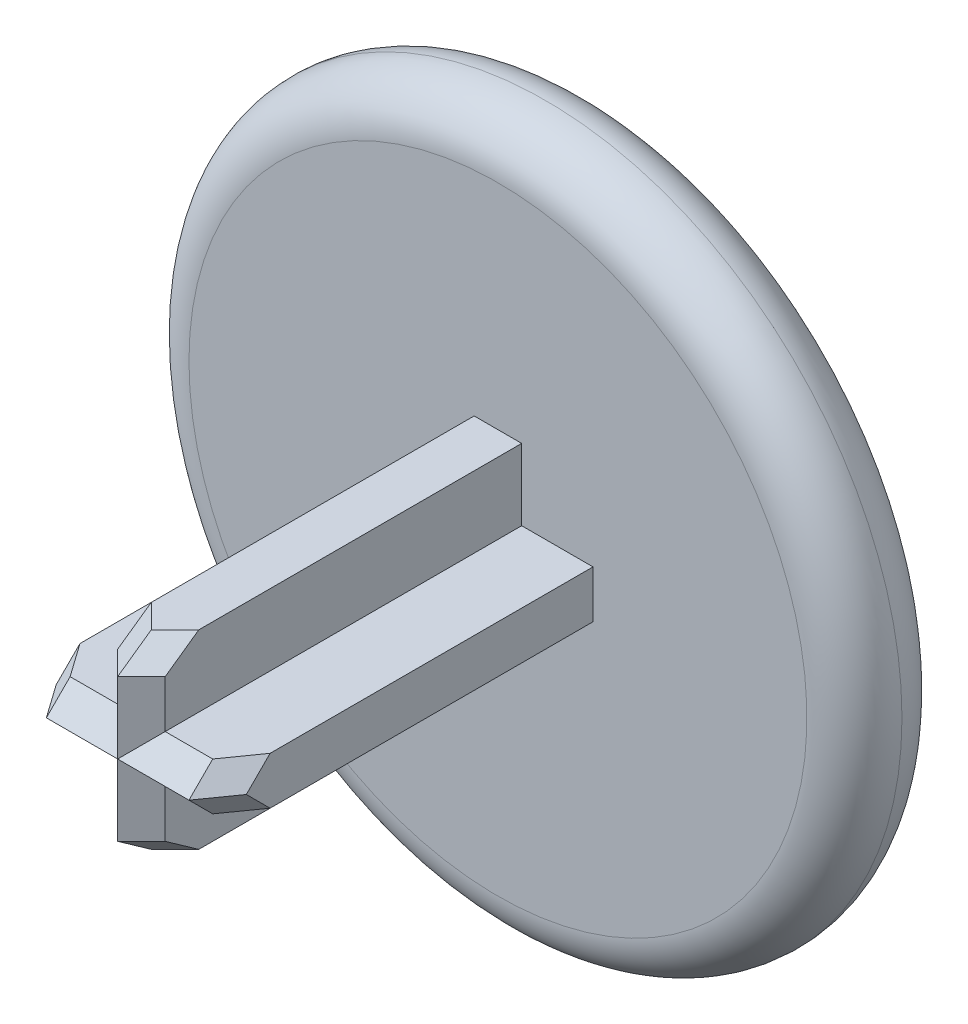
ISO-10303-21;
HEADER;
FILE_DESCRIPTION(('STEP AP214'),'2;1');
FILE_NAME('part.step','',(''),(''),'','','');
FILE_SCHEMA(('AUTOMOTIVE_DESIGN { 1 0 10303 214 1 1 1 1 }'));
ENDSEC;
DATA;
#1=APPLICATION_CONTEXT('core data for automotive mechanical design processes');
#2=APPLICATION_PROTOCOL_DEFINITION('international standard','automotive_design',2000,#1);
#3=PRODUCT_CONTEXT('',#1,'mechanical');
#4=PRODUCT('Part','Part','',(#3));
#5=PRODUCT_RELATED_PRODUCT_CATEGORY('part','',(#4));
#6=PRODUCT_DEFINITION_FORMATION('','',#4);
#7=PRODUCT_DEFINITION_CONTEXT('part definition',#1,'design');
#8=PRODUCT_DEFINITION('design','',#6,#7);
#9=PRODUCT_DEFINITION_SHAPE('','',#8);
#10=(LENGTH_UNIT() NAMED_UNIT(*) SI_UNIT(.MILLI.,.METRE.));
#11=(NAMED_UNIT(*) PLANE_ANGLE_UNIT() SI_UNIT($,.RADIAN.));
#12=(NAMED_UNIT(*) SI_UNIT($,.STERADIAN.) SOLID_ANGLE_UNIT());
#13=UNCERTAINTY_MEASURE_WITH_UNIT(LENGTH_MEASURE(1.E-05),#10,'distance_accuracy_value','');
#14=(GEOMETRIC_REPRESENTATION_CONTEXT(3) GLOBAL_UNCERTAINTY_ASSIGNED_CONTEXT((#13)) GLOBAL_UNIT_ASSIGNED_CONTEXT((#10,
#11,#12)) REPRESENTATION_CONTEXT('',''));
#15=CARTESIAN_POINT('',(0.,0.,0.));
#16=DIRECTION('',(0.,0.,1.));
#17=DIRECTION('',(1.,0.,0.));
#18=AXIS2_PLACEMENT_3D('',#15,#16,#17);
#19=CARTESIAN_POINT('',(0.5,0.,8.));
#20=DIRECTION('',(1.,0.,0.));
#21=DIRECTION('',(0.,0.,-1.));
#22=AXIS2_PLACEMENT_3D('',#19,#20,#21);
#23=PLANE('',#22);
#24=DIRECTION('',(0.,0.,-1.));
#25=VECTOR('',#24,1.);
#26=CARTESIAN_POINT('',(0.5,2.,8.));
#27=LINE('',#26,#25);
#28=CARTESIAN_POINT('',(0.5,2.,6.79289321881345));
#29=VERTEX_POINT('',#28);
#30=CARTESIAN_POINT('',(0.5,2.,0.));
#31=VERTEX_POINT('',#30);
#32=EDGE_CURVE('E278',#29,#31,#27,.T.);
#33=ORIENTED_EDGE('',*,*,#32,.F.);
#34=DIRECTION('',(0.,-0.577350269189627,0.816496580927725));
#35=VECTOR('',#34,1.);
#36=CARTESIAN_POINT('',(0.5,0.764297739604482,8.54044011451988));
#37=LINE('',#36,#35);
#38=CARTESIAN_POINT('',(0.5,1.5,7.5));
#39=VERTEX_POINT('',#38);
#40=EDGE_CURVE('E96',#29,#39,#37,.T.);
#41=ORIENTED_EDGE('',*,*,#40,.T.);
#42=DIRECTION('',(0.,-1.,0.));
#43=VECTOR('',#42,1.);
#44=CARTESIAN_POINT('',(0.5,0.,7.5));
#45=LINE('',#44,#43);
#46=CARTESIAN_POINT('',(0.5,0.5,7.5));
#47=VERTEX_POINT('',#46);
#48=EDGE_CURVE('E330',#39,#47,#45,.T.);
#49=ORIENTED_EDGE('',*,*,#48,.T.);
#50=DIRECTION('',(0.,0.,-1.));
#51=VECTOR('',#50,1.);
#52=CARTESIAN_POINT('',(0.5,0.5,8.));
#53=LINE('',#52,#51);
#54=CARTESIAN_POINT('',(0.5,0.5,0.));
#55=VERTEX_POINT('',#54);
#56=EDGE_CURVE('E258',#47,#55,#53,.T.);
#57=ORIENTED_EDGE('',*,*,#56,.T.);
#58=DIRECTION('',(0.,-1.,0.));
#59=VECTOR('',#58,1.);
#60=CARTESIAN_POINT('',(0.5,0.,0.));
#61=LINE('',#60,#59);
#62=EDGE_CURVE('E297',#31,#55,#61,.T.);
#63=ORIENTED_EDGE('',*,*,#62,.F.);
#64=EDGE_LOOP('',(#33,#41,#49,#57,#63));
#65=FACE_BOUND('',#64,.T.);
#66=ADVANCED_FACE('F79',(#65),#23,.T.);
#67=CARTESIAN_POINT('',(-0.5,0.,8.));
#68=DIRECTION('',(1.,0.,0.));
#69=DIRECTION('',(0.,0.,-1.));
#70=AXIS2_PLACEMENT_3D('',#67,#68,#69);
#71=PLANE('',#70);
#72=DIRECTION('',(0.,1.,0.));
#73=VECTOR('',#72,1.);
#74=CARTESIAN_POINT('',(-0.5,2.,7.5));
#75=LINE('',#74,#73);
#76=CARTESIAN_POINT('',(-0.5,0.5,7.5));
#77=VERTEX_POINT('',#76);
#78=CARTESIAN_POINT('',(-0.5,1.5,7.5));
#79=VERTEX_POINT('',#78);
#80=EDGE_CURVE('E322',#77,#79,#75,.T.);
#81=ORIENTED_EDGE('',*,*,#80,.T.);
#82=DIRECTION('',(0.,-0.577350269189626,0.816496580927726));
#83=VECTOR('',#82,1.);
#84=CARTESIAN_POINT('',(-0.5,1.59763107293782,7.3619288125423));
#85=LINE('',#84,#83);
#86=CARTESIAN_POINT('',(-0.5,2.,6.79289321881345));
#87=VERTEX_POINT('',#86);
#88=EDGE_CURVE('E428',#79,#87,#85,.F.);
#89=ORIENTED_EDGE('',*,*,#88,.T.);
#90=DIRECTION('',(0.,0.,-1.));
#91=VECTOR('',#90,1.);
#92=CARTESIAN_POINT('',(-0.5,2.,8.));
#93=LINE('',#92,#91);
#94=CARTESIAN_POINT('',(-0.5,2.,0.));
#95=VERTEX_POINT('',#94);
#96=EDGE_CURVE('E275',#87,#95,#93,.T.);
#97=ORIENTED_EDGE('',*,*,#96,.T.);
#98=DIRECTION('',(0.,-1.,0.));
#99=VECTOR('',#98,1.);
#100=CARTESIAN_POINT('',(-0.5,0.,0.));
#101=LINE('',#100,#99);
#102=CARTESIAN_POINT('',(-0.5,0.5,0.));
#103=VERTEX_POINT('',#102);
#104=EDGE_CURVE('E466',#95,#103,#101,.T.);
#105=ORIENTED_EDGE('',*,*,#104,.T.);
#106=DIRECTION('',(0.,0.,-1.));
#107=VECTOR('',#106,1.);
#108=CARTESIAN_POINT('',(-0.5,0.5,8.));
#109=LINE('',#108,#107);
#110=EDGE_CURVE('E272',#77,#103,#109,.T.);
#111=ORIENTED_EDGE('',*,*,#110,.F.);
#112=EDGE_LOOP('',(#81,#89,#97,#105,#111));
#113=FACE_BOUND('',#112,.T.);
#114=ADVANCED_FACE('F536',(#113),#71,.F.);
#115=CARTESIAN_POINT('',(0.,2.,8.));
#116=DIRECTION('',(0.,1.,0.));
#117=DIRECTION('',(0.,0.,1.));
#118=AXIS2_PLACEMENT_3D('',#115,#116,#117);
#119=PLANE('',#118);
#120=ORIENTED_EDGE('',*,*,#96,.F.);
#121=DIRECTION('',(0.707106781186545,0.,0.70710678118655));
#122=VECTOR('',#121,1.);
#123=CARTESIAN_POINT('',(0.353553390593274,2.,7.64644660940673));
#124=LINE('',#123,#122);
#125=CARTESIAN_POINT('',(0.,2.,7.29289321881345));
#126=VERTEX_POINT('',#125);
#127=EDGE_CURVE('E421',#87,#126,#124,.T.);
#128=ORIENTED_EDGE('',*,*,#127,.T.);
#129=DIRECTION('',(0.707106781186548,0.,-0.707106781186547));
#130=VECTOR('',#129,1.);
#131=CARTESIAN_POINT('',(-0.353553390593273,2.,7.64644660940673));
#132=LINE('',#131,#130);
#133=EDGE_CURVE('E418',#126,#29,#132,.T.);
#134=ORIENTED_EDGE('',*,*,#133,.T.);
#135=ORIENTED_EDGE('',*,*,#32,.T.);
#136=DIRECTION('',(1.,0.,0.));
#137=VECTOR('',#136,1.);
#138=CARTESIAN_POINT('',(0.,2.,0.));
#139=LINE('',#138,#137);
#140=EDGE_CURVE('E462',#95,#31,#139,.T.);
#141=ORIENTED_EDGE('',*,*,#140,.F.);
#142=EDGE_LOOP('',(#120,#128,#134,#135,#141));
#143=FACE_BOUND('',#142,.T.);
#144=ADVANCED_FACE('F544',(#143),#119,.T.);
#145=CARTESIAN_POINT('',(2.,0.,8.));
#146=DIRECTION('',(1.,0.,0.));
#147=DIRECTION('',(0.,0.,-1.));
#148=AXIS2_PLACEMENT_3D('',#145,#146,#147);
#149=PLANE('',#148);
#150=DIRECTION('',(0.,-0.707106781186548,0.707106781186547));
#151=VECTOR('',#150,1.);
#152=CARTESIAN_POINT('',(2.,-0.353553390593273,7.64644660940673));
#153=LINE('',#152,#151);
#154=CARTESIAN_POINT('',(2.,0.5,6.79289321881345));
#155=VERTEX_POINT('',#154);
#156=CARTESIAN_POINT('',(2.,0.,7.29289321881345));
#157=VERTEX_POINT('',#156);
#158=EDGE_CURVE('E401',#155,#157,#153,.T.);
#159=ORIENTED_EDGE('',*,*,#158,.T.);
#160=DIRECTION('',(0.,-0.707106781186545,-0.70710678118655));
#161=VECTOR('',#160,1.);
#162=CARTESIAN_POINT('',(2.,0.353553390593274,7.64644660940673));
#163=LINE('',#162,#161);
#164=CARTESIAN_POINT('',(2.,-0.5,6.79289321881345));
#165=VERTEX_POINT('',#164);
#166=EDGE_CURVE('E245',#157,#165,#163,.T.);
#167=ORIENTED_EDGE('',*,*,#166,.T.);
#168=DIRECTION('',(0.,0.,-1.));
#169=VECTOR('',#168,1.);
#170=CARTESIAN_POINT('',(2.,-0.5,8.));
#171=LINE('',#170,#169);
#172=CARTESIAN_POINT('',(2.,-0.5,0.));
#173=VERTEX_POINT('',#172);
#174=EDGE_CURVE('E226',#165,#173,#171,.T.);
#175=ORIENTED_EDGE('',*,*,#174,.T.);
#176=DIRECTION('',(0.,-1.,0.));
#177=VECTOR('',#176,1.);
#178=CARTESIAN_POINT('',(2.,0.,0.));
#179=LINE('',#178,#177);
#180=CARTESIAN_POINT('',(2.,0.5,0.));
#181=VERTEX_POINT('',#180);
#182=EDGE_CURVE('E242',#181,#173,#179,.T.);
#183=ORIENTED_EDGE('',*,*,#182,.F.);
#184=DIRECTION('',(0.,0.,-1.));
#185=VECTOR('',#184,1.);
#186=CARTESIAN_POINT('',(2.,0.5,8.));
#187=LINE('',#186,#185);
#188=EDGE_CURVE('E248',#155,#181,#187,.T.);
#189=ORIENTED_EDGE('',*,*,#188,.F.);
#190=EDGE_LOOP('',(#159,#167,#175,#183,#189));
#191=FACE_BOUND('',#190,.T.);
#192=ADVANCED_FACE('F240',(#191),#149,.T.);
#193=CARTESIAN_POINT('',(0.,0.5,8.));
#194=DIRECTION('',(0.,1.,0.));
#195=DIRECTION('',(0.,0.,1.));
#196=AXIS2_PLACEMENT_3D('',#193,#194,#195);
#197=PLANE('',#196);
#198=DIRECTION('',(1.,0.,0.));
#199=VECTOR('',#198,1.);
#200=CARTESIAN_POINT('',(0.,0.5,7.5));
#201=LINE('',#200,#199);
#202=CARTESIAN_POINT('',(1.5,0.5,7.5));
#203=VERTEX_POINT('',#202);
#204=EDGE_CURVE('E326',#47,#203,#201,.T.);
#205=ORIENTED_EDGE('',*,*,#204,.T.);
#206=DIRECTION('',(0.577350269189627,0.,-0.816496580927725));
#207=VECTOR('',#206,1.);
#208=CARTESIAN_POINT('',(0.764297739604482,0.5,8.54044011451988));
#209=LINE('',#208,#207);
#210=EDGE_CURVE('E415',#203,#155,#209,.T.);
#211=ORIENTED_EDGE('',*,*,#210,.T.);
#212=ORIENTED_EDGE('',*,*,#188,.T.);
#213=DIRECTION('',(1.,0.,0.));
#214=VECTOR('',#213,1.);
#215=CARTESIAN_POINT('',(0.,0.5,0.));
#216=LINE('',#215,#214);
#217=EDGE_CURVE('E253',#55,#181,#216,.T.);
#218=ORIENTED_EDGE('',*,*,#217,.F.);
#219=ORIENTED_EDGE('',*,*,#56,.F.);
#220=EDGE_LOOP('',(#205,#211,#212,#218,#219));
#221=FACE_BOUND('',#220,.T.);
#222=ADVANCED_FACE('F550',(#221),#197,.T.);
#223=CARTESIAN_POINT('',(0.,-0.5,8.));
#224=DIRECTION('',(0.,1.,0.));
#225=DIRECTION('',(0.,0.,1.));
#226=AXIS2_PLACEMENT_3D('',#223,#224,#225);
#227=PLANE('',#226);
#228=ORIENTED_EDGE('',*,*,#174,.F.);
#229=DIRECTION('',(0.577350269189626,0.,-0.816496580927726));
#230=VECTOR('',#229,1.);
#231=CARTESIAN_POINT('',(1.59763107293782,-0.5,7.3619288125423));
#232=LINE('',#231,#230);
#233=CARTESIAN_POINT('',(1.5,-0.5,7.5));
#234=VERTEX_POINT('',#233);
#235=EDGE_CURVE('E406',#165,#234,#232,.F.);
#236=ORIENTED_EDGE('',*,*,#235,.T.);
#237=DIRECTION('',(-1.,0.,0.));
#238=VECTOR('',#237,1.);
#239=CARTESIAN_POINT('',(0.5,-0.5,7.5));
#240=LINE('',#239,#238);
#241=CARTESIAN_POINT('',(0.5,-0.5,7.5));
#242=VERTEX_POINT('',#241);
#243=EDGE_CURVE('E316',#234,#242,#240,.T.);
#244=ORIENTED_EDGE('',*,*,#243,.T.);
#245=DIRECTION('',(0.,0.,-1.));
#246=VECTOR('',#245,1.);
#247=CARTESIAN_POINT('',(0.5,-0.5,8.));
#248=LINE('',#247,#246);
#249=CARTESIAN_POINT('',(0.5,-0.5,0.));
#250=VERTEX_POINT('',#249);
#251=EDGE_CURVE('E228',#242,#250,#248,.T.);
#252=ORIENTED_EDGE('',*,*,#251,.T.);
#253=DIRECTION('',(1.,0.,0.));
#254=VECTOR('',#253,1.);
#255=CARTESIAN_POINT('',(0.,-0.5,0.));
#256=LINE('',#255,#254);
#257=EDGE_CURVE('E223',#250,#173,#256,.T.);
#258=ORIENTED_EDGE('',*,*,#257,.T.);
#259=EDGE_LOOP('',(#228,#236,#244,#252,#258));
#260=FACE_BOUND('',#259,.T.);
#261=ADVANCED_FACE('F225',(#260),#227,.F.);
#262=CARTESIAN_POINT('',(0.,0.5,8.));
#263=DIRECTION('',(0.,1.,0.));
#264=DIRECTION('',(0.,0.,1.));
#265=AXIS2_PLACEMENT_3D('',#262,#263,#264);
#266=PLANE('',#265);
#267=DIRECTION('',(0.,0.,-1.));
#268=VECTOR('',#267,1.);
#269=CARTESIAN_POINT('',(-2.,0.5,8.));
#270=LINE('',#269,#268);
#271=CARTESIAN_POINT('',(-2.,0.5,6.79289321881345));
#272=VERTEX_POINT('',#271);
#273=CARTESIAN_POINT('',(-2.,0.5,0.));
#274=VERTEX_POINT('',#273);
#275=EDGE_CURVE('E269',#272,#274,#270,.T.);
#276=ORIENTED_EDGE('',*,*,#275,.F.);
#277=DIRECTION('',(-0.577350269189625,0.,-0.816496580927726));
#278=VECTOR('',#277,1.);
#279=CARTESIAN_POINT('',(-0.764297739604484,0.5,8.54044011451988));
#280=LINE('',#279,#278);
#281=CARTESIAN_POINT('',(-1.5,0.5,7.5));
#282=VERTEX_POINT('',#281);
#283=EDGE_CURVE('E376',#272,#282,#280,.F.);
#284=ORIENTED_EDGE('',*,*,#283,.T.);
#285=DIRECTION('',(1.,0.,0.));
#286=VECTOR('',#285,1.);
#287=CARTESIAN_POINT('',(0.,0.5,7.5));
#288=LINE('',#287,#286);
#289=EDGE_CURVE('E319',#282,#77,#288,.T.);
#290=ORIENTED_EDGE('',*,*,#289,.T.);
#291=ORIENTED_EDGE('',*,*,#110,.T.);
#292=DIRECTION('',(1.,0.,0.));
#293=VECTOR('',#292,1.);
#294=CARTESIAN_POINT('',(0.,0.5,0.));
#295=LINE('',#294,#293);
#296=EDGE_CURVE('E470',#274,#103,#295,.T.);
#297=ORIENTED_EDGE('',*,*,#296,.F.);
#298=EDGE_LOOP('',(#276,#284,#290,#291,#297));
#299=FACE_BOUND('',#298,.T.);
#300=ADVANCED_FACE('F499',(#299),#266,.T.);
#301=CARTESIAN_POINT('',(-2.,0.,8.));
#302=DIRECTION('',(1.,0.,0.));
#303=DIRECTION('',(0.,0.,-1.));
#304=AXIS2_PLACEMENT_3D('',#301,#302,#303);
#305=PLANE('',#304);
#306=DIRECTION('',(0.,0.,-1.));
#307=VECTOR('',#306,1.);
#308=CARTESIAN_POINT('',(-2.,-0.5,8.));
#309=LINE('',#308,#307);
#310=CARTESIAN_POINT('',(-2.,-0.5,6.79289321881345));
#311=VERTEX_POINT('',#310);
#312=CARTESIAN_POINT('',(-2.,-0.5,0.));
#313=VERTEX_POINT('',#312);
#314=EDGE_CURVE('E247',#311,#313,#309,.T.);
#315=ORIENTED_EDGE('',*,*,#314,.F.);
#316=DIRECTION('',(0.,0.707106781186545,0.70710678118655));
#317=VECTOR('',#316,1.);
#318=CARTESIAN_POINT('',(-2.,0.353553390593274,7.64644660940673));
#319=LINE('',#318,#317);
#320=CARTESIAN_POINT('',(-2.,0.,7.29289321881345));
#321=VERTEX_POINT('',#320);
#322=EDGE_CURVE('E366',#311,#321,#319,.T.);
#323=ORIENTED_EDGE('',*,*,#322,.T.);
#324=DIRECTION('',(0.,0.707106781186545,-0.70710678118655));
#325=VECTOR('',#324,1.);
#326=CARTESIAN_POINT('',(-2.,0.146446609406726,7.14644660940673));
#327=LINE('',#326,#325);
#328=EDGE_CURVE('E333',#321,#272,#327,.T.);
#329=ORIENTED_EDGE('',*,*,#328,.T.);
#330=ORIENTED_EDGE('',*,*,#275,.T.);
#331=DIRECTION('',(0.,-1.,0.));
#332=VECTOR('',#331,1.);
#333=CARTESIAN_POINT('',(-2.,0.,0.));
#334=LINE('',#333,#332);
#335=EDGE_CURVE('E235',#274,#313,#334,.T.);
#336=ORIENTED_EDGE('',*,*,#335,.T.);
#337=EDGE_LOOP('',(#315,#323,#329,#330,#336));
#338=FACE_BOUND('',#337,.T.);
#339=ADVANCED_FACE('F480',(#338),#305,.F.);
#340=DIRECTION('',(-1.,0.,0.));
#341=VECTOR('',#340,1.);
#342=CARTESIAN_POINT('',(-2.,-0.5,7.5));
#343=LINE('',#342,#341);
#344=CARTESIAN_POINT('',(-0.5,-0.5,7.5));
#345=VERTEX_POINT('',#344);
#346=CARTESIAN_POINT('',(-1.5,-0.5,7.5));
#347=VERTEX_POINT('',#346);
#348=EDGE_CURVE('E305',#345,#347,#343,.T.);
#349=ORIENTED_EDGE('',*,*,#348,.T.);
#350=DIRECTION('',(-0.577350269189626,0.,-0.816496580927726));
#351=VECTOR('',#350,1.);
#352=CARTESIAN_POINT('',(-1.59763107293782,-0.5,7.3619288125423));
#353=LINE('',#352,#351);
#354=EDGE_CURVE('E373',#347,#311,#353,.T.);
#355=ORIENTED_EDGE('',*,*,#354,.T.);
#356=ORIENTED_EDGE('',*,*,#314,.T.);
#357=CARTESIAN_POINT('',(-0.5,-0.5,0.));
#358=VERTEX_POINT('',#357);
#359=EDGE_CURVE('E234',#313,#358,#256,.T.);
#360=ORIENTED_EDGE('',*,*,#359,.T.);
#361=DIRECTION('',(0.,0.,-1.));
#362=VECTOR('',#361,1.);
#363=CARTESIAN_POINT('',(-0.5,-0.5,8.));
#364=LINE('',#363,#362);
#365=EDGE_CURVE('E302',#345,#358,#364,.T.);
#366=ORIENTED_EDGE('',*,*,#365,.F.);
#367=EDGE_LOOP('',(#349,#355,#356,#360,#366));
#368=FACE_BOUND('',#367,.T.);
#369=ADVANCED_FACE('F488',(#368),#227,.F.);
#370=CARTESIAN_POINT('',(-0.5,2.,8.));
#371=DIRECTION('',(1.,0.,0.));
#372=DIRECTION('',(0.,0.,-1.));
#373=AXIS2_PLACEMENT_3D('',#370,#371,#372);
#374=PLANE('',#373);
#375=DIRECTION('',(0.,0.,-1.));
#376=VECTOR('',#375,1.);
#377=CARTESIAN_POINT('',(-0.5,-2.,8.));
#378=LINE('',#377,#376);
#379=CARTESIAN_POINT('',(-0.5,-2.,6.79289321881345));
#380=VERTEX_POINT('',#379);
#381=CARTESIAN_POINT('',(-0.5,-2.,0.));
#382=VERTEX_POINT('',#381);
#383=EDGE_CURVE('E294',#380,#382,#378,.T.);
#384=ORIENTED_EDGE('',*,*,#383,.F.);
#385=DIRECTION('',(0.,0.577350269189625,0.816496580927726));
#386=VECTOR('',#385,1.);
#387=CARTESIAN_POINT('',(-0.5,-1.71548220313557,7.19526214587564));
#388=LINE('',#387,#386);
#389=CARTESIAN_POINT('',(-0.5,-1.5,7.5));
#390=VERTEX_POINT('',#389);
#391=EDGE_CURVE('E389',#380,#390,#388,.T.);
#392=ORIENTED_EDGE('',*,*,#391,.T.);
#393=DIRECTION('',(0.,1.,0.));
#394=VECTOR('',#393,1.);
#395=CARTESIAN_POINT('',(-0.5,-0.5,7.5));
#396=LINE('',#395,#394);
#397=EDGE_CURVE('E309',#390,#345,#396,.T.);
#398=ORIENTED_EDGE('',*,*,#397,.T.);
#399=ORIENTED_EDGE('',*,*,#365,.T.);
#400=DIRECTION('',(0.,-1.,0.));
#401=VECTOR('',#400,1.);
#402=CARTESIAN_POINT('',(-0.5,2.,0.));
#403=LINE('',#402,#401);
#404=EDGE_CURVE('E289',#358,#382,#403,.T.);
#405=ORIENTED_EDGE('',*,*,#404,.T.);
#406=EDGE_LOOP('',(#384,#392,#398,#399,#405));
#407=FACE_BOUND('',#406,.T.);
#408=ADVANCED_FACE('F584',(#407),#374,.F.);
#409=CARTESIAN_POINT('',(-0.5,-2.,8.));
#410=DIRECTION('',(0.,1.,0.));
#411=DIRECTION('',(0.,0.,1.));
#412=AXIS2_PLACEMENT_3D('',#409,#410,#411);
#413=PLANE('',#412);
#414=DIRECTION('',(-0.707106781186545,0.,0.70710678118655));
#415=VECTOR('',#414,1.);
#416=CARTESIAN_POINT('',(-0.353553390593274,-2.,7.64644660940673));
#417=LINE('',#416,#415);
#418=CARTESIAN_POINT('',(0.5,-2.,6.79289321881345));
#419=VERTEX_POINT('',#418);
#420=CARTESIAN_POINT('',(0.,-2.,7.29289321881345));
#421=VERTEX_POINT('',#420);
#422=EDGE_CURVE('E382',#419,#421,#417,.T.);
#423=ORIENTED_EDGE('',*,*,#422,.T.);
#424=DIRECTION('',(-0.707106781186545,0.,-0.70710678118655));
#425=VECTOR('',#424,1.);
#426=CARTESIAN_POINT('',(-0.146446609406726,-2.,7.14644660940673));
#427=LINE('',#426,#425);
#428=EDGE_CURVE('E385',#421,#380,#427,.T.);
#429=ORIENTED_EDGE('',*,*,#428,.T.);
#430=ORIENTED_EDGE('',*,*,#383,.T.);
#431=DIRECTION('',(1.,0.,0.));
#432=VECTOR('',#431,1.);
#433=CARTESIAN_POINT('',(-0.5,-2.,0.));
#434=LINE('',#433,#432);
#435=CARTESIAN_POINT('',(0.5,-2.,0.));
#436=VERTEX_POINT('',#435);
#437=EDGE_CURVE('E284',#382,#436,#434,.T.);
#438=ORIENTED_EDGE('',*,*,#437,.T.);
#439=DIRECTION('',(0.,0.,-1.));
#440=VECTOR('',#439,1.);
#441=CARTESIAN_POINT('',(0.5,-2.,8.));
#442=LINE('',#441,#440);
#443=EDGE_CURVE('E293',#419,#436,#442,.T.);
#444=ORIENTED_EDGE('',*,*,#443,.F.);
#445=EDGE_LOOP('',(#423,#429,#430,#438,#444));
#446=FACE_BOUND('',#445,.T.);
#447=ADVANCED_FACE('F611',(#446),#413,.F.);
#448=CARTESIAN_POINT('',(0.5,2.,8.));
#449=DIRECTION('',(1.,0.,0.));
#450=DIRECTION('',(0.,0.,-1.));
#451=AXIS2_PLACEMENT_3D('',#448,#449,#450);
#452=PLANE('',#451);
#453=DIRECTION('',(0.,-1.,0.));
#454=VECTOR('',#453,1.);
#455=CARTESIAN_POINT('',(0.5,2.,7.5));
#456=LINE('',#455,#454);
#457=CARTESIAN_POINT('',(0.5,-1.5,7.5));
#458=VERTEX_POINT('',#457);
#459=EDGE_CURVE('E312',#242,#458,#456,.T.);
#460=ORIENTED_EDGE('',*,*,#459,.T.);
#461=DIRECTION('',(0.,0.577350269189625,0.816496580927727));
#462=VECTOR('',#461,1.);
#463=CARTESIAN_POINT('',(0.5,-0.0976310729378193,9.48324915610194));
#464=LINE('',#463,#462);
#465=EDGE_CURVE('E398',#458,#419,#464,.F.);
#466=ORIENTED_EDGE('',*,*,#465,.T.);
#467=ORIENTED_EDGE('',*,*,#443,.T.);
#468=DIRECTION('',(0.,-1.,0.));
#469=VECTOR('',#468,1.);
#470=CARTESIAN_POINT('',(0.5,2.,0.));
#471=LINE('',#470,#469);
#472=EDGE_CURVE('E281',#250,#436,#471,.T.);
#473=ORIENTED_EDGE('',*,*,#472,.F.);
#474=ORIENTED_EDGE('',*,*,#251,.F.);
#475=EDGE_LOOP('',(#460,#466,#467,#473,#474));
#476=FACE_BOUND('',#475,.T.);
#477=ADVANCED_FACE('F618',(#476),#452,.T.);
#478=CARTESIAN_POINT('',(0.,0.5,7.5));
#479=DIRECTION('',(0.,-0.707106781186547,-0.707106781186548));
#480=DIRECTION('',(1.,0.,0.));
#481=AXIS2_PLACEMENT_3D('',#478,#479,#480);
#482=PLANE('',#481);
#483=DIRECTION('',(-1.,0.,0.));
#484=VECTOR('',#483,1.);
#485=CARTESIAN_POINT('',(0.,0.,8.));
#486=LINE('',#485,#484);
#487=CARTESIAN_POINT('',(1.5,0.,8.));
#488=VERTEX_POINT('',#487);
#489=CARTESIAN_POINT('',(0.,0.,8.));
#490=VERTEX_POINT('',#489);
#491=EDGE_CURVE('E358',#488,#490,#486,.T.);
#492=ORIENTED_EDGE('',*,*,#491,.F.);
#493=DIRECTION('',(0.,-0.707106781186548,0.707106781186547));
#494=VECTOR('',#493,1.);
#495=CARTESIAN_POINT('',(1.5,0.5,7.5));
#496=LINE('',#495,#494);
#497=EDGE_CURVE('E412',#488,#203,#496,.F.);
#498=ORIENTED_EDGE('',*,*,#497,.T.);
#499=ORIENTED_EDGE('',*,*,#204,.F.);
#500=DIRECTION('',(0.577350269189626,0.577350269189626,-0.577350269189625));
#501=VECTOR('',#500,1.);
#502=CARTESIAN_POINT('',(0.333333333333333,0.333333333333333,7.66666666666667));
#503=LINE('',#502,#501);
#504=EDGE_CURVE('E285',#490,#47,#503,.T.);
#505=ORIENTED_EDGE('',*,*,#504,.F.);
#506=EDGE_LOOP('',(#492,#498,#499,#505));
#507=FACE_BOUND('',#506,.T.);
#508=ADVANCED_FACE('F520',(#507),#482,.F.);
#509=CARTESIAN_POINT('',(0.5,0.,7.5));
#510=DIRECTION('',(-0.707106781186547,0.,-0.707106781186548));
#511=DIRECTION('',(0.,-1.,0.));
#512=AXIS2_PLACEMENT_3D('',#509,#510,#511);
#513=PLANE('',#512);
#514=ORIENTED_EDGE('',*,*,#48,.F.);
#515=DIRECTION('',(0.707106781186548,0.,-0.707106781186547));
#516=VECTOR('',#515,1.);
#517=CARTESIAN_POINT('',(0.5,1.5,7.5));
#518=LINE('',#517,#516);
#519=CARTESIAN_POINT('',(0.,1.5,8.));
#520=VERTEX_POINT('',#519);
#521=EDGE_CURVE('E103',#39,#520,#518,.F.);
#522=ORIENTED_EDGE('',*,*,#521,.T.);
#523=DIRECTION('',(0.,1.,0.));
#524=VECTOR('',#523,1.);
#525=CARTESIAN_POINT('',(0.,0.,8.));
#526=LINE('',#525,#524);
#527=EDGE_CURVE('E355',#490,#520,#526,.T.);
#528=ORIENTED_EDGE('',*,*,#527,.F.);
#529=ORIENTED_EDGE('',*,*,#504,.T.);
#530=EDGE_LOOP('',(#514,#522,#528,#529));
#531=FACE_BOUND('',#530,.T.);
#532=ADVANCED_FACE('F522',(#531),#513,.F.);
#533=CARTESIAN_POINT('',(0.,0.,8.));
#534=DIRECTION('',(0.,-0.70710678118655,0.707106781186545));
#535=DIRECTION('',(-1.,0.,0.));
#536=AXIS2_PLACEMENT_3D('',#533,#534,#535);
#537=PLANE('',#536);
#538=ORIENTED_EDGE('',*,*,#243,.F.);
#539=DIRECTION('',(0.,0.707106781186545,0.70710678118655));
#540=VECTOR('',#539,1.);
#541=CARTESIAN_POINT('',(1.5,0.,8.));
#542=LINE('',#541,#540);
#543=EDGE_CURVE('E409',#234,#488,#542,.T.);
#544=ORIENTED_EDGE('',*,*,#543,.T.);
#545=ORIENTED_EDGE('',*,*,#491,.T.);
#546=DIRECTION('',(-0.577350269189625,0.577350269189625,0.577350269189628));
#547=VECTOR('',#546,1.);
#548=CARTESIAN_POINT('',(-0.33333333333333,0.33333333333333,8.33333333333333));
#549=LINE('',#548,#547);
#550=EDGE_CURVE('E351',#242,#490,#549,.T.);
#551=ORIENTED_EDGE('',*,*,#550,.F.);
#552=EDGE_LOOP('',(#538,#544,#545,#551));
#553=FACE_BOUND('',#552,.T.);
#554=ADVANCED_FACE('F559',(#553),#537,.T.);
#555=CARTESIAN_POINT('',(0.,0.,8.));
#556=DIRECTION('',(-0.70710678118655,0.,0.707106781186545));
#557=DIRECTION('',(0.,1.,0.));
#558=AXIS2_PLACEMENT_3D('',#555,#556,#557);
#559=PLANE('',#558);
#560=ORIENTED_EDGE('',*,*,#527,.T.);
#561=DIRECTION('',(-0.707106781186545,0.,-0.70710678118655));
#562=VECTOR('',#561,1.);
#563=CARTESIAN_POINT('',(0.,1.5,8.));
#564=LINE('',#563,#562);
#565=EDGE_CURVE('E425',#520,#79,#564,.T.);
#566=ORIENTED_EDGE('',*,*,#565,.T.);
#567=ORIENTED_EDGE('',*,*,#80,.F.);
#568=DIRECTION('',(-0.577350269189625,0.577350269189625,-0.577350269189628));
#569=VECTOR('',#568,1.);
#570=CARTESIAN_POINT('',(-0.333333333333334,0.333333333333334,7.66666666666666));
#571=LINE('',#570,#569);
#572=EDGE_CURVE('E347',#490,#77,#571,.T.);
#573=ORIENTED_EDGE('',*,*,#572,.F.);
#574=EDGE_LOOP('',(#560,#566,#567,#573));
#575=FACE_BOUND('',#574,.T.);
#576=ADVANCED_FACE('F532',(#575),#559,.T.);
#577=CARTESIAN_POINT('',(0.5,2.,7.5));
#578=DIRECTION('',(-0.70710678118655,0.,-0.707106781186545));
#579=DIRECTION('',(0.,-1.,0.));
#580=AXIS2_PLACEMENT_3D('',#577,#578,#579);
#581=PLANE('',#580);
#582=DIRECTION('',(0.,1.,0.));
#583=VECTOR('',#582,1.);
#584=CARTESIAN_POINT('',(0.,0.,8.));
#585=LINE('',#584,#583);
#586=CARTESIAN_POINT('',(0.,-1.5,8.));
#587=VERTEX_POINT('',#586);
#588=EDGE_CURVE('E343',#587,#490,#585,.T.);
#589=ORIENTED_EDGE('',*,*,#588,.F.);
#590=DIRECTION('',(-0.707106781186545,0.,0.70710678118655));
#591=VECTOR('',#590,1.);
#592=CARTESIAN_POINT('',(0.5,-1.5,7.5));
#593=LINE('',#592,#591);
#594=EDGE_CURVE('E395',#587,#458,#593,.F.);
#595=ORIENTED_EDGE('',*,*,#594,.T.);
#596=ORIENTED_EDGE('',*,*,#459,.F.);
#597=ORIENTED_EDGE('',*,*,#550,.T.);
#598=EDGE_LOOP('',(#589,#595,#596,#597));
#599=FACE_BOUND('',#598,.T.);
#600=ADVANCED_FACE('F528',(#599),#581,.F.);
#601=CARTESIAN_POINT('',(0.,0.5,7.5));
#602=DIRECTION('',(0.,-0.70710678118655,-0.707106781186545));
#603=DIRECTION('',(1.,0.,0.));
#604=AXIS2_PLACEMENT_3D('',#601,#602,#603);
#605=PLANE('',#604);
#606=ORIENTED_EDGE('',*,*,#289,.F.);
#607=DIRECTION('',(0.,0.707106781186545,-0.70710678118655));
#608=VECTOR('',#607,1.);
#609=CARTESIAN_POINT('',(-1.5,0.,8.));
#610=LINE('',#609,#608);
#611=CARTESIAN_POINT('',(-1.5,0.,8.));
#612=VERTEX_POINT('',#611);
#613=EDGE_CURVE('E379',#282,#612,#610,.F.);
#614=ORIENTED_EDGE('',*,*,#613,.T.);
#615=DIRECTION('',(-1.,0.,0.));
#616=VECTOR('',#615,1.);
#617=CARTESIAN_POINT('',(0.,0.,8.));
#618=LINE('',#617,#616);
#619=EDGE_CURVE('E338',#490,#612,#618,.T.);
#620=ORIENTED_EDGE('',*,*,#619,.F.);
#621=ORIENTED_EDGE('',*,*,#572,.T.);
#622=EDGE_LOOP('',(#606,#614,#620,#621));
#623=FACE_BOUND('',#622,.T.);
#624=ADVANCED_FACE('F505',(#623),#605,.F.);
#625=CARTESIAN_POINT('',(0.,0.,8.));
#626=DIRECTION('',(-0.70710678118655,0.,0.707106781186545));
#627=DIRECTION('',(0.,1.,0.));
#628=AXIS2_PLACEMENT_3D('',#625,#626,#627);
#629=PLANE('',#628);
#630=ORIENTED_EDGE('',*,*,#397,.F.);
#631=DIRECTION('',(0.707106781186545,0.,0.70710678118655));
#632=VECTOR('',#631,1.);
#633=CARTESIAN_POINT('',(0.,-1.5,8.));
#634=LINE('',#633,#632);
#635=EDGE_CURVE('E392',#390,#587,#634,.T.);
#636=ORIENTED_EDGE('',*,*,#635,.T.);
#637=ORIENTED_EDGE('',*,*,#588,.T.);
#638=DIRECTION('',(-0.577350269189625,-0.577350269189625,-0.577350269189628));
#639=VECTOR('',#638,1.);
#640=CARTESIAN_POINT('',(0.,0.,8.));
#641=LINE('',#640,#639);
#642=EDGE_CURVE('E334',#345,#490,#641,.F.);
#643=ORIENTED_EDGE('',*,*,#642,.F.);
#644=EDGE_LOOP('',(#630,#636,#637,#643));
#645=FACE_BOUND('',#644,.T.);
#646=ADVANCED_FACE('F511',(#645),#629,.T.);
#647=CARTESIAN_POINT('',(0.,0.,8.));
#648=DIRECTION('',(0.,-0.70710678118655,0.707106781186545));
#649=DIRECTION('',(-1.,0.,0.));
#650=AXIS2_PLACEMENT_3D('',#647,#648,#649);
#651=PLANE('',#650);
#652=ORIENTED_EDGE('',*,*,#619,.T.);
#653=DIRECTION('',(0.,-0.707106781186545,-0.70710678118655));
#654=VECTOR('',#653,1.);
#655=CARTESIAN_POINT('',(-1.5,-0.5,7.5));
#656=LINE('',#655,#654);
#657=EDGE_CURVE('E370',#612,#347,#656,.T.);
#658=ORIENTED_EDGE('',*,*,#657,.T.);
#659=ORIENTED_EDGE('',*,*,#348,.F.);
#660=ORIENTED_EDGE('',*,*,#642,.T.);
#661=EDGE_LOOP('',(#652,#658,#659,#660));
#662=FACE_BOUND('',#661,.T.);
#663=ADVANCED_FACE('F507',(#662),#651,.T.);
#664=CARTESIAN_POINT('',(-2.,-0.353553390593274,7.64644660940673));
#665=DIRECTION('',(0.707106781186547,-0.500000000000002,-0.499999999999999));
#666=DIRECTION('',(0.,0.707106781186545,-0.70710678118655));
#667=AXIS2_PLACEMENT_3D('',#664,#665,#666);
#668=PLANE('',#667);
#669=ORIENTED_EDGE('',*,*,#283,.F.);
#670=ORIENTED_EDGE('',*,*,#328,.F.);
#671=DIRECTION('',(-0.577350269189625,0.,-0.816496580927726));
#672=VECTOR('',#671,1.);
#673=CARTESIAN_POINT('',(-1.83333333333333,0.,7.52859547920897));
#674=LINE('',#673,#672);
#675=EDGE_CURVE('E339',#612,#321,#674,.T.);
#676=ORIENTED_EDGE('',*,*,#675,.F.);
#677=ORIENTED_EDGE('',*,*,#613,.F.);
#678=EDGE_LOOP('',(#669,#670,#676,#677));
#679=FACE_BOUND('',#678,.T.);
#680=ADVANCED_FACE('F502',(#679),#668,.F.);
#681=CARTESIAN_POINT('',(-2.,0.353553390593274,7.64644660940673));
#682=DIRECTION('',(-0.707106781186547,-0.500000000000002,0.499999999999999));
#683=DIRECTION('',(0.,-0.707106781186545,-0.70710678118655));
#684=AXIS2_PLACEMENT_3D('',#681,#682,#683);
#685=PLANE('',#684);
#686=ORIENTED_EDGE('',*,*,#354,.F.);
#687=ORIENTED_EDGE('',*,*,#657,.F.);
#688=ORIENTED_EDGE('',*,*,#675,.T.);
#689=ORIENTED_EDGE('',*,*,#322,.F.);
#690=EDGE_LOOP('',(#686,#687,#688,#689));
#691=FACE_BOUND('',#690,.T.);
#692=ADVANCED_FACE('F493',(#691),#685,.T.);
#693=CARTESIAN_POINT('',(-0.603553390593272,-2.,7.89644660940673));
#694=DIRECTION('',(-0.500000000000002,0.707106781186547,-0.499999999999999));
#695=DIRECTION('',(-0.707106781186545,0.,0.70710678118655));
#696=AXIS2_PLACEMENT_3D('',#693,#694,#695);
#697=PLANE('',#696);
#698=ORIENTED_EDGE('',*,*,#465,.F.);
#699=ORIENTED_EDGE('',*,*,#594,.F.);
#700=DIRECTION('',(0.,0.577350269189625,0.816496580927726));
#701=VECTOR('',#700,1.);
#702=CARTESIAN_POINT('',(0.,-1.71548220313557,7.69526214587564));
#703=LINE('',#702,#701);
#704=EDGE_CURVE('E437',#421,#587,#703,.T.);
#705=ORIENTED_EDGE('',*,*,#704,.F.);
#706=ORIENTED_EDGE('',*,*,#422,.F.);
#707=EDGE_LOOP('',(#698,#699,#705,#706));
#708=FACE_BOUND('',#707,.T.);
#709=ADVANCED_FACE('F697',(#708),#697,.F.);
#710=CARTESIAN_POINT('',(0.103553390593275,-2.,7.39644660940673));
#711=DIRECTION('',(-0.500000000000002,-0.707106781186547,0.499999999999999));
#712=DIRECTION('',(0.707106781186545,0.,0.70710678118655));
#713=AXIS2_PLACEMENT_3D('',#710,#711,#712);
#714=PLANE('',#713);
#715=ORIENTED_EDGE('',*,*,#704,.T.);
#716=ORIENTED_EDGE('',*,*,#635,.F.);
#717=ORIENTED_EDGE('',*,*,#391,.F.);
#718=ORIENTED_EDGE('',*,*,#428,.F.);
#719=EDGE_LOOP('',(#715,#716,#717,#718));
#720=FACE_BOUND('',#719,.T.);
#721=ADVANCED_FACE('F706',(#720),#714,.T.);
#722=CARTESIAN_POINT('',(2.,-0.353553390593273,7.64644660940673));
#723=DIRECTION('',(0.707106781186547,0.5,0.500000000000001));
#724=DIRECTION('',(0.,0.707106781186548,-0.707106781186547));
#725=AXIS2_PLACEMENT_3D('',#722,#723,#724);
#726=PLANE('',#725);
#727=ORIENTED_EDGE('',*,*,#210,.F.);
#728=ORIENTED_EDGE('',*,*,#497,.F.);
#729=DIRECTION('',(-0.577350269189626,0.,0.816496580927725));
#730=VECTOR('',#729,1.);
#731=CARTESIAN_POINT('',(1.83333333333333,0.,7.52859547920897));
#732=LINE('',#731,#730);
#733=EDGE_CURVE('E441',#157,#488,#732,.T.);
#734=ORIENTED_EDGE('',*,*,#733,.F.);
#735=ORIENTED_EDGE('',*,*,#158,.F.);
#736=EDGE_LOOP('',(#727,#728,#734,#735));
#737=FACE_BOUND('',#736,.T.);
#738=ADVANCED_FACE('F555',(#737),#726,.T.);
#739=CARTESIAN_POINT('',(2.,0.353553390593274,7.64644660940673));
#740=DIRECTION('',(-0.707106781186546,0.500000000000003,-0.5));
#741=DIRECTION('',(0.,-0.707106781186545,-0.70710678118655));
#742=AXIS2_PLACEMENT_3D('',#739,#740,#741);
#743=PLANE('',#742);
#744=ORIENTED_EDGE('',*,*,#733,.T.);
#745=ORIENTED_EDGE('',*,*,#543,.F.);
#746=ORIENTED_EDGE('',*,*,#235,.F.);
#747=ORIENTED_EDGE('',*,*,#166,.F.);
#748=EDGE_LOOP('',(#744,#745,#746,#747));
#749=FACE_BOUND('',#748,.T.);
#750=ADVANCED_FACE('F558',(#749),#743,.F.);
#751=CARTESIAN_POINT('',(-0.353553390593273,2.,7.64644660940673));
#752=DIRECTION('',(0.5,0.707106781186547,0.500000000000001));
#753=DIRECTION('',(-0.707106781186548,0.,0.707106781186547));
#754=AXIS2_PLACEMENT_3D('',#751,#752,#753);
#755=PLANE('',#754);
#756=ORIENTED_EDGE('',*,*,#40,.F.);
#757=ORIENTED_EDGE('',*,*,#133,.F.);
#758=DIRECTION('',(0.,0.577350269189626,-0.816496580927725));
#759=VECTOR('',#758,1.);
#760=CARTESIAN_POINT('',(0.,1.83333333333333,7.52859547920897));
#761=LINE('',#760,#759);
#762=EDGE_CURVE('E445',#520,#126,#761,.T.);
#763=ORIENTED_EDGE('',*,*,#762,.F.);
#764=ORIENTED_EDGE('',*,*,#521,.F.);
#765=EDGE_LOOP('',(#756,#757,#763,#764));
#766=FACE_BOUND('',#765,.T.);
#767=ADVANCED_FACE('F733',(#766),#755,.T.);
#768=CARTESIAN_POINT('',(0.353553390593274,2.,7.64644660940673));
#769=DIRECTION('',(0.500000000000003,-0.707106781186546,-0.5));
#770=DIRECTION('',(0.707106781186545,0.,0.70710678118655));
#771=AXIS2_PLACEMENT_3D('',#768,#769,#770);
#772=PLANE('',#771);
#773=ORIENTED_EDGE('',*,*,#88,.F.);
#774=ORIENTED_EDGE('',*,*,#565,.F.);
#775=ORIENTED_EDGE('',*,*,#762,.T.);
#776=ORIENTED_EDGE('',*,*,#127,.F.);
#777=EDGE_LOOP('',(#773,#774,#775,#776));
#778=FACE_BOUND('',#777,.T.);
#779=ADVANCED_FACE('F540',(#778),#772,.F.);
#780=CARTESIAN_POINT('',(0.,0.,-2.));
#781=DIRECTION('',(0.,0.,-1.));
#782=DIRECTION('',(-1.,0.,0.));
#783=AXIS2_PLACEMENT_3D('',#780,#781,#782);
#784=PLANE('',#783);
#785=CARTESIAN_POINT('',(0.,0.,-2.));
#786=DIRECTION('',(0.,0.,-1.));
#787=DIRECTION('',(-1.,0.,0.));
#788=AXIS2_PLACEMENT_3D('',#785,#786,#787);
#789=CIRCLE('',#788,6.5);
#790=CARTESIAN_POINT('',(-6.5,0.,-2.));
#791=VERTEX_POINT('',#790);
#792=EDGE_CURVE('E12',#791,#791,#789,.T.);
#793=ORIENTED_EDGE('',*,*,#792,.T.);
#794=EDGE_LOOP('',(#793));
#795=FACE_BOUND('',#794,.T.);
#796=ADVANCED_FACE('F750',(#795),#784,.T.);
#797=CARTESIAN_POINT('',(0.,0.,0.));
#798=DIRECTION('',(0.,0.,-1.));
#799=DIRECTION('',(-1.,0.,0.));
#800=AXIS2_PLACEMENT_3D('',#797,#798,#799);
#801=PLANE('',#800);
#802=CARTESIAN_POINT('',(0.,0.,0.));
#803=DIRECTION('',(0.,0.,-1.));
#804=DIRECTION('',(-1.,0.,0.));
#805=AXIS2_PLACEMENT_3D('',#802,#803,#804);
#806=CIRCLE('',#805,6.5);
#807=CARTESIAN_POINT('',(-6.5,0.,0.));
#808=VERTEX_POINT('',#807);
#809=EDGE_CURVE('E89',#808,#808,#806,.F.);
#810=ORIENTED_EDGE('',*,*,#809,.T.);
#811=EDGE_LOOP('',(#810));
#812=FACE_BOUND('',#811,.T.);
#813=ORIENTED_EDGE('',*,*,#257,.F.);
#814=ORIENTED_EDGE('',*,*,#472,.T.);
#815=ORIENTED_EDGE('',*,*,#437,.F.);
#816=ORIENTED_EDGE('',*,*,#404,.F.);
#817=ORIENTED_EDGE('',*,*,#359,.F.);
#818=ORIENTED_EDGE('',*,*,#335,.F.);
#819=ORIENTED_EDGE('',*,*,#296,.T.);
#820=ORIENTED_EDGE('',*,*,#104,.F.);
#821=ORIENTED_EDGE('',*,*,#140,.T.);
#822=ORIENTED_EDGE('',*,*,#62,.T.);
#823=ORIENTED_EDGE('',*,*,#217,.T.);
#824=ORIENTED_EDGE('',*,*,#182,.T.);
#825=EDGE_LOOP('',(#813,#814,#815,#816,#817,#818,#819,#820,#821,#822,#823,#824));
#826=FACE_BOUND('',#825,.T.);
#827=ADVANCED_FACE('F250',(#812,#826),#801,.F.);
#828=CARTESIAN_POINT('',(0.,0.,-1.));
#829=DIRECTION('',(0.,0.,-1.));
#830=DIRECTION('',(-1.,0.,0.));
#831=AXIS2_PLACEMENT_3D('',#828,#829,#830);
#832=TOROIDAL_SURFACE('',#831,6.5,1.);
#833=ORIENTED_EDGE('',*,*,#792,.F.);
#834=EDGE_LOOP('',(#833));
#835=FACE_BOUND('',#834,.T.);
#836=CARTESIAN_POINT('',(0.,0.,-1.));
#837=DIRECTION('',(0.,0.,-1.));
#838=DIRECTION('',(-1.,0.,0.));
#839=AXIS2_PLACEMENT_3D('',#836,#837,#838);
#840=CIRCLE('',#839,7.5);
#841=CARTESIAN_POINT('',(-7.5,0.,-1.));
#842=VERTEX_POINT('',#841);
#843=EDGE_CURVE('E83',#842,#842,#840,.F.);
#844=ORIENTED_EDGE('',*,*,#843,.F.);
#845=EDGE_LOOP('',(#844));
#846=FACE_BOUND('',#845,.T.);
#847=ADVANCED_FACE('F81',(#835,#846),#832,.T.);
#848=CARTESIAN_POINT('',(0.,0.,-1.));
#849=DIRECTION('',(0.,0.,-1.));
#850=DIRECTION('',(-1.,0.,0.));
#851=AXIS2_PLACEMENT_3D('',#848,#849,#850);
#852=TOROIDAL_SURFACE('',#851,6.5,1.);
#853=ORIENTED_EDGE('',*,*,#809,.F.);
#854=EDGE_LOOP('',(#853));
#855=FACE_BOUND('',#854,.T.);
#856=ORIENTED_EDGE('',*,*,#843,.T.);
#857=EDGE_LOOP('',(#856));
#858=FACE_BOUND('',#857,.T.);
#859=ADVANCED_FACE('F453',(#855,#858),#852,.T.);
#860=CLOSED_SHELL('',(#66,#114,#144,#192,#222,#261,#300,#339,#369,#408,#447,#477,#508,#532,#554,
#576,#600,#624,#646,#663,#680,#692,#709,#721,#738,#750,#767,#779,#796,#827,#847,#859));
#861=MANIFOLD_SOLID_BREP('B2',#860);
#862=ADVANCED_BREP_SHAPE_REPRESENTATION('',(#18,#861),#14);
#863=SHAPE_DEFINITION_REPRESENTATION(#9,#862);
ENDSEC;
END-ISO-10303-21;
